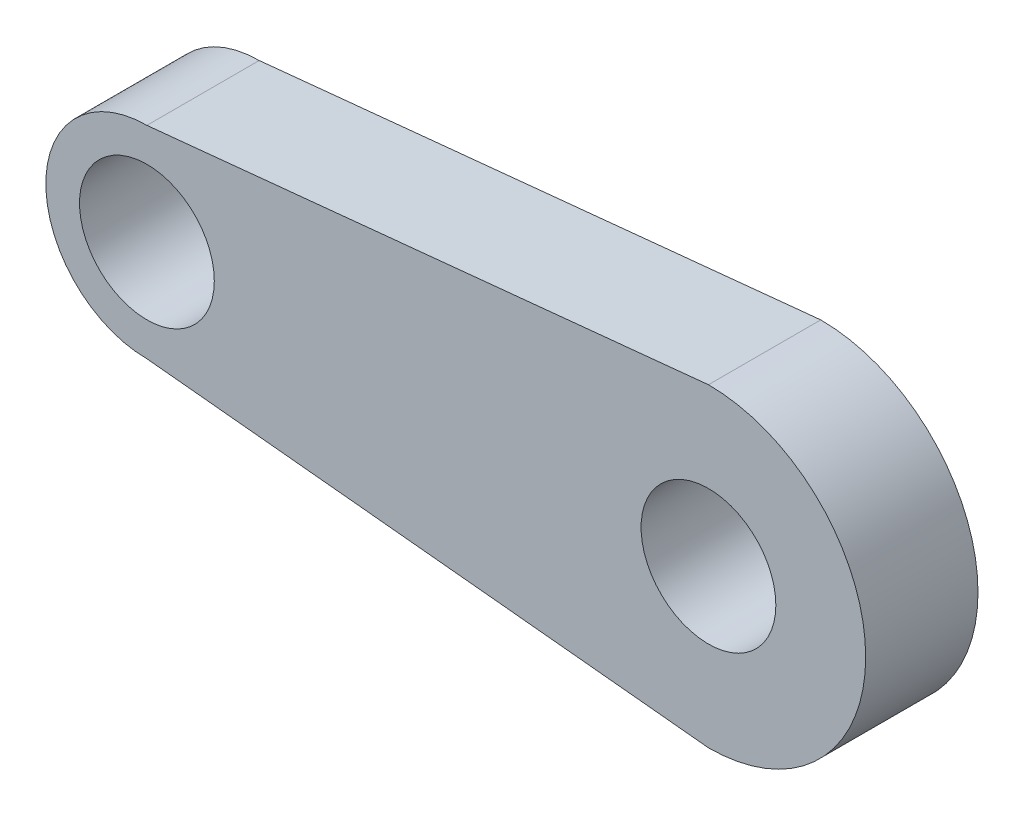
ISO-10303-21;
HEADER;
FILE_DESCRIPTION(('STEP AP214'),'2;1');
FILE_NAME('part.step','',(''),(''),'','','');
FILE_SCHEMA(('AUTOMOTIVE_DESIGN { 1 0 10303 214 1 1 1 1 }'));
ENDSEC;
DATA;
#1=APPLICATION_CONTEXT('core data for automotive mechanical design processes');
#2=APPLICATION_PROTOCOL_DEFINITION('international standard','automotive_design',2000,#1);
#3=PRODUCT_CONTEXT('',#1,'mechanical');
#4=PRODUCT('Part','Part','',(#3));
#5=PRODUCT_RELATED_PRODUCT_CATEGORY('part','',(#4));
#6=PRODUCT_DEFINITION_FORMATION('','',#4);
#7=PRODUCT_DEFINITION_CONTEXT('part definition',#1,'design');
#8=PRODUCT_DEFINITION('design','',#6,#7);
#9=PRODUCT_DEFINITION_SHAPE('','',#8);
#10=(LENGTH_UNIT() NAMED_UNIT(*) SI_UNIT(.MILLI.,.METRE.));
#11=(NAMED_UNIT(*) PLANE_ANGLE_UNIT() SI_UNIT($,.RADIAN.));
#12=(NAMED_UNIT(*) SI_UNIT($,.STERADIAN.) SOLID_ANGLE_UNIT());
#13=UNCERTAINTY_MEASURE_WITH_UNIT(LENGTH_MEASURE(1.E-05),#10,'distance_accuracy_value','');
#14=(GEOMETRIC_REPRESENTATION_CONTEXT(3) GLOBAL_UNCERTAINTY_ASSIGNED_CONTEXT((#13)) GLOBAL_UNIT_ASSIGNED_CONTEXT((#10,
#11,#12)) REPRESENTATION_CONTEXT('',''));
#15=CARTESIAN_POINT('',(0.,0.,0.));
#16=DIRECTION('',(0.,0.,1.));
#17=DIRECTION('',(1.,0.,0.));
#18=AXIS2_PLACEMENT_3D('',#15,#16,#17);
#19=CARTESIAN_POINT('',(-0.69306930693069,-6.93069306930694,5.));
#20=DIRECTION('',(0.0995037190209983,0.995037190209989,0.));
#21=DIRECTION('',(-0.995037190209989,0.0995037190209983,0.));
#22=AXIS2_PLACEMENT_3D('',#19,#20,#21);
#23=PLANE('',#22);
#24=DIRECTION('',(0.995037190209989,-0.0995037190209983,0.));
#25=VECTOR('',#24,1.);
#26=CARTESIAN_POINT('',(-0.69306930693069,-6.93069306930694,0.));
#27=LINE('',#26,#25);
#28=CARTESIAN_POINT('',(-25.,-4.50000000000002,0.));
#29=VERTEX_POINT('',#28);
#30=CARTESIAN_POINT('',(0.,-7.00000000000001,0.));
#31=VERTEX_POINT('',#30);
#32=EDGE_CURVE('E112',#29,#31,#27,.T.);
#33=ORIENTED_EDGE('',*,*,#32,.T.);
#34=DIRECTION('',(0.,0.,-1.));
#35=VECTOR('',#34,1.);
#36=CARTESIAN_POINT('',(0.,-7.00000000000001,5.));
#37=LINE('',#36,#35);
#38=CARTESIAN_POINT('',(0.,-7.00000000000001,5.));
#39=VERTEX_POINT('',#38);
#40=EDGE_CURVE('E11',#39,#31,#37,.T.);
#41=ORIENTED_EDGE('',*,*,#40,.F.);
#42=DIRECTION('',(0.995037190209989,-0.0995037190209983,0.));
#43=VECTOR('',#42,1.);
#44=CARTESIAN_POINT('',(-0.69306930693069,-6.93069306930694,5.));
#45=LINE('',#44,#43);
#46=CARTESIAN_POINT('',(-25.,-4.50000000000002,5.));
#47=VERTEX_POINT('',#46);
#48=EDGE_CURVE('E91',#47,#39,#45,.T.);
#49=ORIENTED_EDGE('',*,*,#48,.F.);
#50=DIRECTION('',(0.,0.,-1.));
#51=VECTOR('',#50,1.);
#52=CARTESIAN_POINT('',(-25.,-4.50000000000002,5.));
#53=LINE('',#52,#51);
#54=EDGE_CURVE('E111',#47,#29,#53,.T.);
#55=ORIENTED_EDGE('',*,*,#54,.T.);
#56=EDGE_LOOP('',(#33,#41,#49,#55));
#57=FACE_BOUND('',#56,.T.);
#58=ADVANCED_FACE('F43',(#57),#23,.F.);
#59=CARTESIAN_POINT('',(0.,0.,5.));
#60=DIRECTION('',(0.,0.,-1.));
#61=DIRECTION('',(-1.,0.,0.));
#62=AXIS2_PLACEMENT_3D('',#59,#60,#61);
#63=CYLINDRICAL_SURFACE('',#62,7.00000000000001);
#64=CARTESIAN_POINT('',(0.,0.,0.));
#65=DIRECTION('',(0.,0.,1.));
#66=DIRECTION('',(1.,0.,0.));
#67=AXIS2_PLACEMENT_3D('',#64,#65,#66);
#68=CIRCLE('',#67,7.00000000000001);
#69=CARTESIAN_POINT('',(0.,7.00000000000001,0.));
#70=VERTEX_POINT('',#69);
#71=EDGE_CURVE('E96',#31,#70,#68,.T.);
#72=ORIENTED_EDGE('',*,*,#71,.T.);
#73=DIRECTION('',(0.,0.,-1.));
#74=VECTOR('',#73,1.);
#75=CARTESIAN_POINT('',(0.,7.00000000000001,5.));
#76=LINE('',#75,#74);
#77=CARTESIAN_POINT('',(0.,7.00000000000001,5.));
#78=VERTEX_POINT('',#77);
#79=EDGE_CURVE('E51',#78,#70,#76,.T.);
#80=ORIENTED_EDGE('',*,*,#79,.F.);
#81=CARTESIAN_POINT('',(0.,0.,5.));
#82=DIRECTION('',(0.,0.,1.));
#83=DIRECTION('',(1.,0.,0.));
#84=AXIS2_PLACEMENT_3D('',#81,#82,#83);
#85=CIRCLE('',#84,7.00000000000001);
#86=EDGE_CURVE('E85',#39,#78,#85,.T.);
#87=ORIENTED_EDGE('',*,*,#86,.F.);
#88=ORIENTED_EDGE('',*,*,#40,.T.);
#89=EDGE_LOOP('',(#72,#80,#87,#88));
#90=FACE_BOUND('',#89,.T.);
#91=ADVANCED_FACE('F95',(#90),#63,.T.);
#92=CARTESIAN_POINT('',(-0.69306930693069,6.93069306930694,5.));
#93=DIRECTION('',(-0.0995037190209983,0.995037190209989,0.));
#94=DIRECTION('',(-0.995037190209989,-0.0995037190209983,0.));
#95=AXIS2_PLACEMENT_3D('',#92,#93,#94);
#96=PLANE('',#95);
#97=DIRECTION('',(0.995037190209989,0.0995037190209983,0.));
#98=VECTOR('',#97,1.);
#99=CARTESIAN_POINT('',(-0.69306930693069,6.93069306930694,0.));
#100=LINE('',#99,#98);
#101=CARTESIAN_POINT('',(-25.,4.50000000000002,0.));
#102=VERTEX_POINT('',#101);
#103=EDGE_CURVE('E116',#102,#70,#100,.T.);
#104=ORIENTED_EDGE('',*,*,#103,.F.);
#105=DIRECTION('',(0.,0.,-1.));
#106=VECTOR('',#105,1.);
#107=CARTESIAN_POINT('',(-25.,4.50000000000002,5.));
#108=LINE('',#107,#106);
#109=CARTESIAN_POINT('',(-25.,4.50000000000002,5.));
#110=VERTEX_POINT('',#109);
#111=EDGE_CURVE('E75',#110,#102,#108,.T.);
#112=ORIENTED_EDGE('',*,*,#111,.F.);
#113=DIRECTION('',(0.995037190209989,0.0995037190209983,0.));
#114=VECTOR('',#113,1.);
#115=CARTESIAN_POINT('',(-0.69306930693069,6.93069306930694,5.));
#116=LINE('',#115,#114);
#117=EDGE_CURVE('E89',#110,#78,#116,.T.);
#118=ORIENTED_EDGE('',*,*,#117,.T.);
#119=ORIENTED_EDGE('',*,*,#79,.T.);
#120=EDGE_LOOP('',(#104,#112,#118,#119));
#121=FACE_BOUND('',#120,.T.);
#122=ADVANCED_FACE('F100',(#121),#96,.T.);
#123=CARTESIAN_POINT('',(-25.,0.,5.));
#124=DIRECTION('',(0.,0.,-1.));
#125=DIRECTION('',(-1.,0.,0.));
#126=AXIS2_PLACEMENT_3D('',#123,#124,#125);
#127=CYLINDRICAL_SURFACE('',#126,2.99999999999999);
#128=CARTESIAN_POINT('',(-25.,0.,5.));
#129=DIRECTION('',(0.,0.,1.));
#130=DIRECTION('',(1.,0.,0.));
#131=AXIS2_PLACEMENT_3D('',#128,#129,#130);
#132=CIRCLE('',#131,2.99999999999999);
#133=CARTESIAN_POINT('',(-22.,0.,5.));
#134=VERTEX_POINT('',#133);
#135=EDGE_CURVE('E102',#134,#134,#132,.T.);
#136=ORIENTED_EDGE('',*,*,#135,.T.);
#137=EDGE_LOOP('',(#136));
#138=FACE_BOUND('',#137,.T.);
#139=CARTESIAN_POINT('',(-25.,0.,0.));
#140=DIRECTION('',(0.,0.,1.));
#141=DIRECTION('',(1.,0.,0.));
#142=AXIS2_PLACEMENT_3D('',#139,#140,#141);
#143=CIRCLE('',#142,2.99999999999999);
#144=CARTESIAN_POINT('',(-22.,0.,0.));
#145=VERTEX_POINT('',#144);
#146=EDGE_CURVE('E119',#145,#145,#143,.T.);
#147=ORIENTED_EDGE('',*,*,#146,.F.);
#148=EDGE_LOOP('',(#147));
#149=FACE_BOUND('',#148,.T.);
#150=ADVANCED_FACE('F147',(#138,#149),#127,.F.);
#151=CARTESIAN_POINT('',(-25.,0.,5.));
#152=DIRECTION('',(0.,0.,-1.));
#153=DIRECTION('',(-1.,0.,0.));
#154=AXIS2_PLACEMENT_3D('',#151,#152,#153);
#155=CYLINDRICAL_SURFACE('',#154,4.50000000000002);
#156=CARTESIAN_POINT('',(-25.,0.,0.));
#157=DIRECTION('',(0.,0.,1.));
#158=DIRECTION('',(1.,0.,0.));
#159=AXIS2_PLACEMENT_3D('',#156,#157,#158);
#160=CIRCLE('',#159,4.50000000000002);
#161=EDGE_CURVE('E78',#102,#29,#160,.T.);
#162=ORIENTED_EDGE('',*,*,#161,.T.);
#163=ORIENTED_EDGE('',*,*,#54,.F.);
#164=CARTESIAN_POINT('',(-25.,0.,5.));
#165=DIRECTION('',(0.,0.,1.));
#166=DIRECTION('',(1.,0.,0.));
#167=AXIS2_PLACEMENT_3D('',#164,#165,#166);
#168=CIRCLE('',#167,4.50000000000002);
#169=EDGE_CURVE('E59',#110,#47,#168,.T.);
#170=ORIENTED_EDGE('',*,*,#169,.F.);
#171=ORIENTED_EDGE('',*,*,#111,.T.);
#172=EDGE_LOOP('',(#162,#163,#170,#171));
#173=FACE_BOUND('',#172,.T.);
#174=ADVANCED_FACE('F139',(#173),#155,.T.);
#175=CARTESIAN_POINT('',(0.,0.,5.));
#176=DIRECTION('',(0.,0.,-1.));
#177=DIRECTION('',(-1.,0.,0.));
#178=AXIS2_PLACEMENT_3D('',#175,#176,#177);
#179=CYLINDRICAL_SURFACE('',#178,3.);
#180=CARTESIAN_POINT('',(0.,0.,5.));
#181=DIRECTION('',(0.,0.,1.));
#182=DIRECTION('',(1.,0.,0.));
#183=AXIS2_PLACEMENT_3D('',#180,#181,#182);
#184=CIRCLE('',#183,3.);
#185=CARTESIAN_POINT('',(3.,0.,5.));
#186=VERTEX_POINT('',#185);
#187=EDGE_CURVE('E108',#186,#186,#184,.T.);
#188=ORIENTED_EDGE('',*,*,#187,.T.);
#189=EDGE_LOOP('',(#188));
#190=FACE_BOUND('',#189,.T.);
#191=CARTESIAN_POINT('',(0.,0.,0.));
#192=DIRECTION('',(0.,0.,1.));
#193=DIRECTION('',(1.,0.,0.));
#194=AXIS2_PLACEMENT_3D('',#191,#192,#193);
#195=CIRCLE('',#194,3.);
#196=CARTESIAN_POINT('',(3.,0.,0.));
#197=VERTEX_POINT('',#196);
#198=EDGE_CURVE('E122',#197,#197,#195,.T.);
#199=ORIENTED_EDGE('',*,*,#198,.F.);
#200=EDGE_LOOP('',(#199));
#201=FACE_BOUND('',#200,.T.);
#202=ADVANCED_FACE('F137',(#190,#201),#179,.F.);
#203=CARTESIAN_POINT('',(0.,0.,5.));
#204=DIRECTION('',(0.,0.,1.));
#205=DIRECTION('',(1.,0.,0.));
#206=AXIS2_PLACEMENT_3D('',#203,#204,#205);
#207=PLANE('',#206);
#208=ORIENTED_EDGE('',*,*,#48,.T.);
#209=ORIENTED_EDGE('',*,*,#86,.T.);
#210=ORIENTED_EDGE('',*,*,#117,.F.);
#211=ORIENTED_EDGE('',*,*,#169,.T.);
#212=EDGE_LOOP('',(#208,#209,#210,#211));
#213=FACE_BOUND('',#212,.T.);
#214=ORIENTED_EDGE('',*,*,#135,.F.);
#215=EDGE_LOOP('',(#214));
#216=FACE_BOUND('',#215,.T.);
#217=ORIENTED_EDGE('',*,*,#187,.F.);
#218=EDGE_LOOP('',(#217));
#219=FACE_BOUND('',#218,.T.);
#220=ADVANCED_FACE('F86',(#213,#216,#219),#207,.T.);
#221=CARTESIAN_POINT('',(0.,0.,0.));
#222=DIRECTION('',(0.,0.,1.));
#223=DIRECTION('',(1.,0.,0.));
#224=AXIS2_PLACEMENT_3D('',#221,#222,#223);
#225=PLANE('',#224);
#226=ORIENTED_EDGE('',*,*,#32,.F.);
#227=ORIENTED_EDGE('',*,*,#161,.F.);
#228=ORIENTED_EDGE('',*,*,#103,.T.);
#229=ORIENTED_EDGE('',*,*,#71,.F.);
#230=EDGE_LOOP('',(#226,#227,#228,#229));
#231=FACE_BOUND('',#230,.T.);
#232=ORIENTED_EDGE('',*,*,#146,.T.);
#233=EDGE_LOOP('',(#232));
#234=FACE_BOUND('',#233,.T.);
#235=ORIENTED_EDGE('',*,*,#198,.T.);
#236=EDGE_LOOP('',(#235));
#237=FACE_BOUND('',#236,.T.);
#238=ADVANCED_FACE('F129',(#231,#234,#237),#225,.F.);
#239=CLOSED_SHELL('',(#58,#91,#122,#150,#174,#202,#220,#238));
#240=MANIFOLD_SOLID_BREP('B2',#239);
#241=ADVANCED_BREP_SHAPE_REPRESENTATION('',(#18,#240),#14);
#242=SHAPE_DEFINITION_REPRESENTATION(#9,#241);
ENDSEC;
END-ISO-10303-21;
